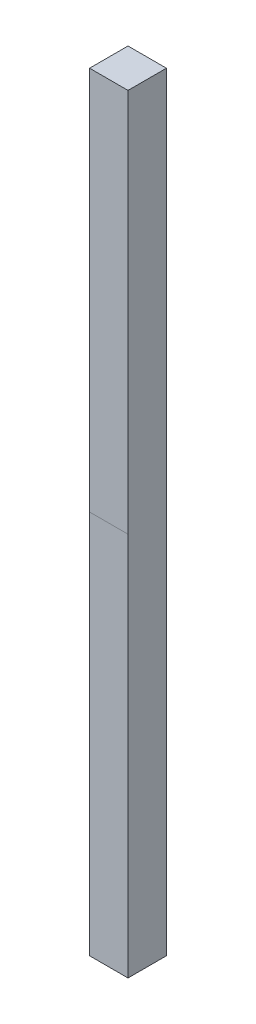
ISO-10303-21;
HEADER;
FILE_DESCRIPTION(('STEP AP214'),'2;1');
FILE_NAME('part.step','',(''),(''),'','','');
FILE_SCHEMA(('AUTOMOTIVE_DESIGN { 1 0 10303 214 1 1 1 1 }'));
ENDSEC;
DATA;
#1=APPLICATION_CONTEXT('core data for automotive mechanical design processes');
#2=APPLICATION_PROTOCOL_DEFINITION('international standard','automotive_design',2000,#1);
#3=PRODUCT_CONTEXT('',#1,'mechanical');
#4=PRODUCT('Part','Part','',(#3));
#5=PRODUCT_RELATED_PRODUCT_CATEGORY('part','',(#4));
#6=PRODUCT_DEFINITION_FORMATION('','',#4);
#7=PRODUCT_DEFINITION_CONTEXT('part definition',#1,'design');
#8=PRODUCT_DEFINITION('design','',#6,#7);
#9=PRODUCT_DEFINITION_SHAPE('','',#8);
#10=(LENGTH_UNIT() NAMED_UNIT(*) SI_UNIT(.MILLI.,.METRE.));
#11=(NAMED_UNIT(*) PLANE_ANGLE_UNIT() SI_UNIT($,.RADIAN.));
#12=(NAMED_UNIT(*) SI_UNIT($,.STERADIAN.) SOLID_ANGLE_UNIT());
#13=UNCERTAINTY_MEASURE_WITH_UNIT(LENGTH_MEASURE(1.E-05),#10,'distance_accuracy_value','');
#14=(GEOMETRIC_REPRESENTATION_CONTEXT(3) GLOBAL_UNCERTAINTY_ASSIGNED_CONTEXT((#13)) GLOBAL_UNIT_ASSIGNED_CONTEXT((#10,
#11,#12)) REPRESENTATION_CONTEXT('',''));
#15=CARTESIAN_POINT('',(0.,0.,0.));
#16=DIRECTION('',(0.,0.,1.));
#17=DIRECTION('',(1.,0.,0.));
#18=AXIS2_PLACEMENT_3D('',#15,#16,#17);
#19=CARTESIAN_POINT('',(0.,508.,0.));
#20=DIRECTION('',(0.,0.,-1.));
#21=DIRECTION('',(-1.,0.,0.));
#22=AXIS2_PLACEMENT_3D('',#19,#20,#21);
#23=PLANE('',#22);
#24=DIRECTION('',(1.,0.,0.));
#25=VECTOR('',#24,1.);
#26=CARTESIAN_POINT('',(0.,254.,0.));
#27=LINE('',#26,#25);
#28=CARTESIAN_POINT('',(0.,254.,0.));
#29=VERTEX_POINT('',#28);
#30=CARTESIAN_POINT('',(25.4,254.,0.));
#31=VERTEX_POINT('',#30);
#32=EDGE_CURVE('E11',#29,#31,#27,.T.);
#33=ORIENTED_EDGE('',*,*,#32,.F.);
#34=DIRECTION('',(0.,-1.,0.));
#35=VECTOR('',#34,1.);
#36=CARTESIAN_POINT('',(0.,508.,0.));
#37=LINE('',#36,#35);
#38=CARTESIAN_POINT('',(0.,0.,0.));
#39=VERTEX_POINT('',#38);
#40=EDGE_CURVE('E83',#29,#39,#37,.T.);
#41=ORIENTED_EDGE('',*,*,#40,.T.);
#42=DIRECTION('',(1.,0.,0.));
#43=VECTOR('',#42,1.);
#44=CARTESIAN_POINT('',(0.,0.,0.));
#45=LINE('',#44,#43);
#46=CARTESIAN_POINT('',(25.4,0.,0.));
#47=VERTEX_POINT('',#46);
#48=EDGE_CURVE('E85',#39,#47,#45,.T.);
#49=ORIENTED_EDGE('',*,*,#48,.T.);
#50=DIRECTION('',(0.,-1.,0.));
#51=VECTOR('',#50,1.);
#52=CARTESIAN_POINT('',(25.4,508.,0.));
#53=LINE('',#52,#51);
#54=EDGE_CURVE('E120',#31,#47,#53,.T.);
#55=ORIENTED_EDGE('',*,*,#54,.F.);
#56=EDGE_LOOP('',(#33,#41,#49,#55));
#57=FACE_BOUND('',#56,.T.);
#58=ADVANCED_FACE('F40',(#57),#23,.F.);
#59=CARTESIAN_POINT('',(0.,508.,0.));
#60=DIRECTION('',(1.,0.,0.));
#61=DIRECTION('',(0.,0.,-1.));
#62=AXIS2_PLACEMENT_3D('',#59,#60,#61);
#63=PLANE('',#62);
#64=DIRECTION('',(0.,0.,1.));
#65=VECTOR('',#64,1.);
#66=CARTESIAN_POINT('',(0.,0.,0.));
#67=LINE('',#66,#65);
#68=CARTESIAN_POINT('',(0.,0.,-25.4));
#69=VERTEX_POINT('',#68);
#70=EDGE_CURVE('E95',#69,#39,#67,.T.);
#71=ORIENTED_EDGE('',*,*,#70,.T.);
#72=ORIENTED_EDGE('',*,*,#40,.F.);
#73=CARTESIAN_POINT('',(0.,508.,0.));
#74=VERTEX_POINT('',#73);
#75=EDGE_CURVE('E49',#74,#29,#37,.T.);
#76=ORIENTED_EDGE('',*,*,#75,.F.);
#77=DIRECTION('',(0.,0.,1.));
#78=VECTOR('',#77,1.);
#79=CARTESIAN_POINT('',(0.,508.,0.));
#80=LINE('',#79,#78);
#81=CARTESIAN_POINT('',(0.,508.,-25.4));
#82=VERTEX_POINT('',#81);
#83=EDGE_CURVE('E107',#82,#74,#80,.T.);
#84=ORIENTED_EDGE('',*,*,#83,.F.);
#85=DIRECTION('',(0.,-1.,0.));
#86=VECTOR('',#85,1.);
#87=CARTESIAN_POINT('',(0.,508.,-25.4));
#88=LINE('',#87,#86);
#89=EDGE_CURVE('E101',#82,#69,#88,.T.);
#90=ORIENTED_EDGE('',*,*,#89,.T.);
#91=EDGE_LOOP('',(#71,#72,#76,#84,#90));
#92=FACE_BOUND('',#91,.T.);
#93=ADVANCED_FACE('F42',(#92),#63,.F.);
#94=ORIENTED_EDGE('',*,*,#75,.T.);
#95=ORIENTED_EDGE('',*,*,#32,.T.);
#96=CARTESIAN_POINT('',(25.4,508.,0.));
#97=VERTEX_POINT('',#96);
#98=EDGE_CURVE('E90',#97,#31,#53,.T.);
#99=ORIENTED_EDGE('',*,*,#98,.F.);
#100=DIRECTION('',(1.,0.,0.));
#101=VECTOR('',#100,1.);
#102=CARTESIAN_POINT('',(0.,508.,0.));
#103=LINE('',#102,#101);
#104=EDGE_CURVE('E110',#74,#97,#103,.T.);
#105=ORIENTED_EDGE('',*,*,#104,.F.);
#106=EDGE_LOOP('',(#94,#95,#99,#105));
#107=FACE_BOUND('',#106,.T.);
#108=ADVANCED_FACE('F122',(#107),#23,.F.);
#109=CARTESIAN_POINT('',(25.4,508.,0.));
#110=DIRECTION('',(-1.,0.,0.));
#111=DIRECTION('',(0.,0.,1.));
#112=AXIS2_PLACEMENT_3D('',#109,#110,#111);
#113=PLANE('',#112);
#114=DIRECTION('',(0.,0.,-1.));
#115=VECTOR('',#114,1.);
#116=CARTESIAN_POINT('',(25.4,0.,0.));
#117=LINE('',#116,#115);
#118=CARTESIAN_POINT('',(25.4,0.,-25.4));
#119=VERTEX_POINT('',#118);
#120=EDGE_CURVE('E96',#47,#119,#117,.T.);
#121=ORIENTED_EDGE('',*,*,#120,.T.);
#122=DIRECTION('',(0.,-1.,0.));
#123=VECTOR('',#122,1.);
#124=CARTESIAN_POINT('',(25.4,508.,-25.4));
#125=LINE('',#124,#123);
#126=CARTESIAN_POINT('',(25.4,508.,-25.4));
#127=VERTEX_POINT('',#126);
#128=EDGE_CURVE('E117',#127,#119,#125,.T.);
#129=ORIENTED_EDGE('',*,*,#128,.F.);
#130=DIRECTION('',(0.,0.,-1.));
#131=VECTOR('',#130,1.);
#132=CARTESIAN_POINT('',(25.4,508.,0.));
#133=LINE('',#132,#131);
#134=EDGE_CURVE('E112',#97,#127,#133,.T.);
#135=ORIENTED_EDGE('',*,*,#134,.F.);
#136=ORIENTED_EDGE('',*,*,#98,.T.);
#137=ORIENTED_EDGE('',*,*,#54,.T.);
#138=EDGE_LOOP('',(#121,#129,#135,#136,#137));
#139=FACE_BOUND('',#138,.T.);
#140=ADVANCED_FACE('F131',(#139),#113,.F.);
#141=CARTESIAN_POINT('',(0.,508.,-25.4));
#142=DIRECTION('',(0.,0.,1.));
#143=DIRECTION('',(1.,0.,0.));
#144=AXIS2_PLACEMENT_3D('',#141,#142,#143);
#145=PLANE('',#144);
#146=DIRECTION('',(-1.,0.,0.));
#147=VECTOR('',#146,1.);
#148=CARTESIAN_POINT('',(0.,0.,-25.4));
#149=LINE('',#148,#147);
#150=EDGE_CURVE('E105',#119,#69,#149,.T.);
#151=ORIENTED_EDGE('',*,*,#150,.T.);
#152=ORIENTED_EDGE('',*,*,#89,.F.);
#153=DIRECTION('',(-1.,0.,0.));
#154=VECTOR('',#153,1.);
#155=CARTESIAN_POINT('',(0.,508.,-25.4));
#156=LINE('',#155,#154);
#157=EDGE_CURVE('E114',#127,#82,#156,.T.);
#158=ORIENTED_EDGE('',*,*,#157,.F.);
#159=ORIENTED_EDGE('',*,*,#128,.T.);
#160=EDGE_LOOP('',(#151,#152,#158,#159));
#161=FACE_BOUND('',#160,.T.);
#162=ADVANCED_FACE('F129',(#161),#145,.F.);
#163=CARTESIAN_POINT('',(0.,508.,-25.4));
#164=DIRECTION('',(0.,-1.,0.));
#165=DIRECTION('',(0.,0.,-1.));
#166=AXIS2_PLACEMENT_3D('',#163,#164,#165);
#167=PLANE('',#166);
#168=ORIENTED_EDGE('',*,*,#83,.T.);
#169=ORIENTED_EDGE('',*,*,#104,.T.);
#170=ORIENTED_EDGE('',*,*,#134,.T.);
#171=ORIENTED_EDGE('',*,*,#157,.T.);
#172=EDGE_LOOP('',(#168,#169,#170,#171));
#173=FACE_BOUND('',#172,.T.);
#174=ADVANCED_FACE('F124',(#173),#167,.F.);
#175=CARTESIAN_POINT('',(0.,0.,-25.4));
#176=DIRECTION('',(0.,-1.,0.));
#177=DIRECTION('',(0.,0.,-1.));
#178=AXIS2_PLACEMENT_3D('',#175,#176,#177);
#179=PLANE('',#178);
#180=ORIENTED_EDGE('',*,*,#70,.F.);
#181=ORIENTED_EDGE('',*,*,#150,.F.);
#182=ORIENTED_EDGE('',*,*,#120,.F.);
#183=ORIENTED_EDGE('',*,*,#48,.F.);
#184=EDGE_LOOP('',(#180,#181,#182,#183));
#185=FACE_BOUND('',#184,.T.);
#186=ADVANCED_FACE('F93',(#185),#179,.T.);
#187=CLOSED_SHELL('',(#58,#93,#108,#140,#162,#174,#186));
#188=MANIFOLD_SOLID_BREP('B2',#187);
#189=ADVANCED_BREP_SHAPE_REPRESENTATION('',(#18,#188),#14);
#190=SHAPE_DEFINITION_REPRESENTATION(#9,#189);
ENDSEC;
END-ISO-10303-21;
